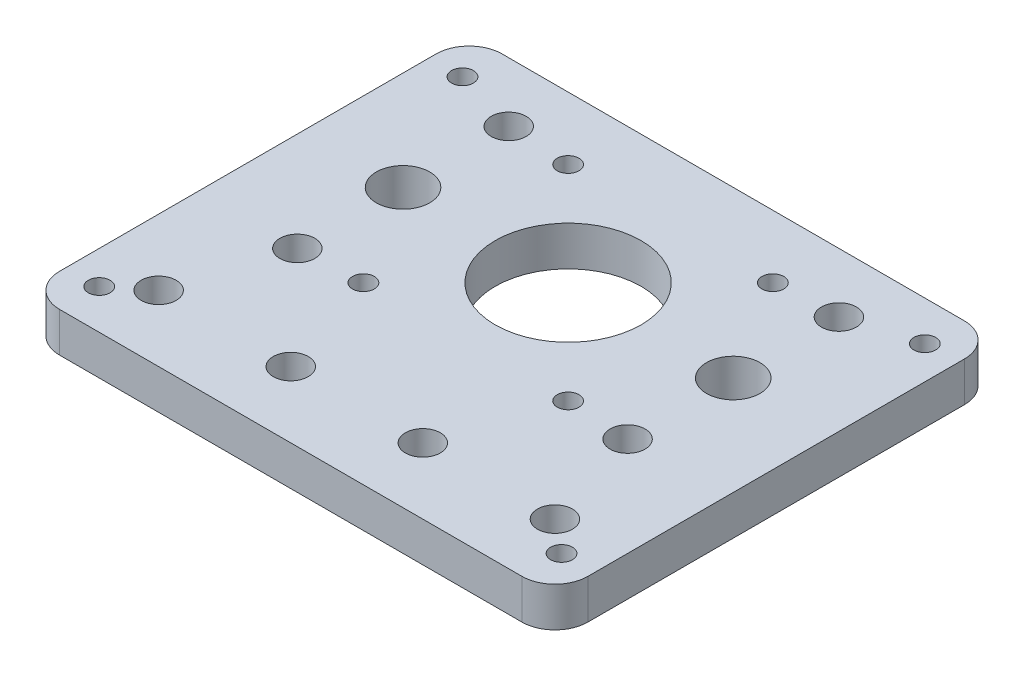
ISO-10303-21;
HEADER;
FILE_DESCRIPTION(('STEP AP214'),'2;1');
FILE_NAME('part.step','',(''),(''),'','','');
FILE_SCHEMA(('AUTOMOTIVE_DESIGN { 1 0 10303 214 1 1 1 1 }'));
ENDSEC;
DATA;
#1=APPLICATION_CONTEXT('core data for automotive mechanical design processes');
#2=APPLICATION_PROTOCOL_DEFINITION('international standard','automotive_design',2000,#1);
#3=PRODUCT_CONTEXT('',#1,'mechanical');
#4=PRODUCT('Part','Part','',(#3));
#5=PRODUCT_RELATED_PRODUCT_CATEGORY('part','',(#4));
#6=PRODUCT_DEFINITION_FORMATION('','',#4);
#7=PRODUCT_DEFINITION_CONTEXT('part definition',#1,'design');
#8=PRODUCT_DEFINITION('design','',#6,#7);
#9=PRODUCT_DEFINITION_SHAPE('','',#8);
#10=(LENGTH_UNIT() NAMED_UNIT(*) SI_UNIT(.MILLI.,.METRE.));
#11=(NAMED_UNIT(*) PLANE_ANGLE_UNIT() SI_UNIT($,.RADIAN.));
#12=(NAMED_UNIT(*) SI_UNIT($,.STERADIAN.) SOLID_ANGLE_UNIT());
#13=UNCERTAINTY_MEASURE_WITH_UNIT(LENGTH_MEASURE(1.E-05),#10,'distance_accuracy_value','');
#14=(GEOMETRIC_REPRESENTATION_CONTEXT(3) GLOBAL_UNCERTAINTY_ASSIGNED_CONTEXT((#13)) GLOBAL_UNIT_ASSIGNED_CONTEXT((#10,
#11,#12)) REPRESENTATION_CONTEXT('',''));
#15=CARTESIAN_POINT('',(0.,0.,0.));
#16=DIRECTION('',(0.,0.,1.));
#17=DIRECTION('',(1.,0.,0.));
#18=AXIS2_PLACEMENT_3D('',#15,#16,#17);
#19=CARTESIAN_POINT('',(-35.,6.,37.));
#20=DIRECTION('',(0.,1.,0.));
#21=DIRECTION('',(0.,0.,1.));
#22=AXIS2_PLACEMENT_3D('',#19,#20,#21);
#23=PLANE('',#22);
#24=CARTESIAN_POINT('',(35.,6.,36.));
#25=DIRECTION('',(0.,1.,0.));
#26=DIRECTION('',(0.,0.,-1.));
#27=AXIS2_PLACEMENT_3D('',#24,#25,#26);
#28=CIRCLE('',#27,1.65);
#29=CARTESIAN_POINT('',(35.,6.,34.35));
#30=VERTEX_POINT('',#29);
#31=EDGE_CURVE('E280',#30,#30,#28,.T.);
#32=ORIENTED_EDGE('',*,*,#31,.F.);
#33=EDGE_LOOP('',(#32));
#34=FACE_BOUND('',#33,.T.);
#35=CARTESIAN_POINT('',(9.99999999999998,6.,32.));
#36=DIRECTION('',(0.,1.,0.));
#37=DIRECTION('',(0.,0.,-1.));
#38=AXIS2_PLACEMENT_3D('',#35,#36,#37);
#39=CIRCLE('',#38,2.65);
#40=CARTESIAN_POINT('',(9.99999999999998,6.,29.35));
#41=VERTEX_POINT('',#40);
#42=EDGE_CURVE('E268',#41,#41,#39,.T.);
#43=ORIENTED_EDGE('',*,*,#42,.F.);
#44=EDGE_LOOP('',(#43));
#45=FACE_BOUND('',#44,.T.);
#46=CARTESIAN_POINT('',(-30.,6.,32.));
#47=DIRECTION('',(0.,1.,0.));
#48=DIRECTION('',(0.,0.,1.));
#49=AXIS2_PLACEMENT_3D('',#46,#47,#48);
#50=CIRCLE('',#49,2.65);
#51=CARTESIAN_POINT('',(-30.,6.,34.65));
#52=VERTEX_POINT('',#51);
#53=EDGE_CURVE('E256',#52,#52,#50,.T.);
#54=ORIENTED_EDGE('',*,*,#53,.F.);
#55=EDGE_LOOP('',(#54));
#56=FACE_BOUND('',#55,.T.);
#57=CARTESIAN_POINT('',(-9.99999999999998,6.,32.));
#58=DIRECTION('',(0.,1.,0.));
#59=DIRECTION('',(0.,0.,1.));
#60=AXIS2_PLACEMENT_3D('',#57,#58,#59);
#61=CIRCLE('',#60,2.65);
#62=CARTESIAN_POINT('',(-9.99999999999998,6.,34.65));
#63=VERTEX_POINT('',#62);
#64=EDGE_CURVE('E244',#63,#63,#61,.T.);
#65=ORIENTED_EDGE('',*,*,#64,.F.);
#66=EDGE_LOOP('',(#65));
#67=FACE_BOUND('',#66,.T.);
#68=CARTESIAN_POINT('',(25.,6.,16.));
#69=DIRECTION('',(0.,1.,0.));
#70=DIRECTION('',(0.,0.,1.));
#71=AXIS2_PLACEMENT_3D('',#68,#69,#70);
#72=CIRCLE('',#71,2.65);
#73=CARTESIAN_POINT('',(25.,6.,18.65));
#74=VERTEX_POINT('',#73);
#75=EDGE_CURVE('E232',#74,#74,#72,.T.);
#76=ORIENTED_EDGE('',*,*,#75,.F.);
#77=EDGE_LOOP('',(#76));
#78=FACE_BOUND('',#77,.T.);
#79=CARTESIAN_POINT('',(-25.,6.,16.));
#80=DIRECTION('',(0.,1.,0.));
#81=DIRECTION('',(0.,0.,-1.));
#82=AXIS2_PLACEMENT_3D('',#79,#80,#81);
#83=CIRCLE('',#82,2.65);
#84=CARTESIAN_POINT('',(-25.,6.,13.35));
#85=VERTEX_POINT('',#84);
#86=EDGE_CURVE('E220',#85,#85,#83,.T.);
#87=ORIENTED_EDGE('',*,*,#86,.F.);
#88=EDGE_LOOP('',(#87));
#89=FACE_BOUND('',#88,.T.);
#90=CARTESIAN_POINT('',(-25.,6.,0.));
#91=DIRECTION('',(0.,1.,0.));
#92=DIRECTION('',(0.,0.,1.));
#93=AXIS2_PLACEMENT_3D('',#90,#91,#92);
#94=CIRCLE('',#93,4.05);
#95=CARTESIAN_POINT('',(-25.,6.,4.05));
#96=VERTEX_POINT('',#95);
#97=EDGE_CURVE('E208',#96,#96,#94,.T.);
#98=ORIENTED_EDGE('',*,*,#97,.F.);
#99=EDGE_LOOP('',(#98));
#100=FACE_BOUND('',#99,.T.);
#101=CARTESIAN_POINT('',(15.5,6.,15.5));
#102=DIRECTION('',(0.,1.,0.));
#103=DIRECTION('',(0.,0.,1.));
#104=AXIS2_PLACEMENT_3D('',#101,#102,#103);
#105=CIRCLE('',#104,1.65);
#106=CARTESIAN_POINT('',(15.5,6.,17.15));
#107=VERTEX_POINT('',#106);
#108=EDGE_CURVE('E196',#107,#107,#105,.T.);
#109=ORIENTED_EDGE('',*,*,#108,.F.);
#110=EDGE_LOOP('',(#109));
#111=FACE_BOUND('',#110,.T.);
#112=CARTESIAN_POINT('',(-15.5,6.,-15.5));
#113=DIRECTION('',(0.,1.,0.));
#114=DIRECTION('',(0.,0.,1.));
#115=AXIS2_PLACEMENT_3D('',#112,#113,#114);
#116=CIRCLE('',#115,1.65);
#117=CARTESIAN_POINT('',(-15.5,6.,-13.85));
#118=VERTEX_POINT('',#117);
#119=EDGE_CURVE('E184',#118,#118,#116,.T.);
#120=ORIENTED_EDGE('',*,*,#119,.F.);
#121=EDGE_LOOP('',(#120));
#122=FACE_BOUND('',#121,.T.);
#123=CARTESIAN_POINT('',(-35.,6.,37.));
#124=DIRECTION('',(0.,1.,0.));
#125=DIRECTION('',(0.,0.,1.));
#126=AXIS2_PLACEMENT_3D('',#123,#124,#125);
#127=CIRCLE('',#126,5.);
#128=CARTESIAN_POINT('',(-40.,6.,37.));
#129=VERTEX_POINT('',#128);
#130=CARTESIAN_POINT('',(-35.,6.,42.));
#131=VERTEX_POINT('',#130);
#132=EDGE_CURVE('E147',#129,#131,#127,.T.);
#133=ORIENTED_EDGE('',*,*,#132,.T.);
#134=DIRECTION('',(1.,0.,0.));
#135=VECTOR('',#134,1.);
#136=CARTESIAN_POINT('',(-35.,6.,42.));
#137=LINE('',#136,#135);
#138=CARTESIAN_POINT('',(35.,6.,42.));
#139=VERTEX_POINT('',#138);
#140=EDGE_CURVE('E95',#131,#139,#137,.T.);
#141=ORIENTED_EDGE('',*,*,#140,.T.);
#142=CARTESIAN_POINT('',(35.,6.,37.));
#143=DIRECTION('',(0.,1.,0.));
#144=DIRECTION('',(0.,0.,1.));
#145=AXIS2_PLACEMENT_3D('',#142,#143,#144);
#146=CIRCLE('',#145,5.);
#147=CARTESIAN_POINT('',(40.,6.,37.));
#148=VERTEX_POINT('',#147);
#149=EDGE_CURVE('E162',#139,#148,#146,.T.);
#150=ORIENTED_EDGE('',*,*,#149,.T.);
#151=DIRECTION('',(0.,0.,-1.));
#152=VECTOR('',#151,1.);
#153=CARTESIAN_POINT('',(40.,6.,-20.));
#154=LINE('',#153,#152);
#155=CARTESIAN_POINT('',(40.,6.,-20.));
#156=VERTEX_POINT('',#155);
#157=EDGE_CURVE('E175',#148,#156,#154,.T.);
#158=ORIENTED_EDGE('',*,*,#157,.T.);
#159=CARTESIAN_POINT('',(35.,6.,-20.));
#160=DIRECTION('',(0.,1.,0.));
#161=DIRECTION('',(0.,0.,1.));
#162=AXIS2_PLACEMENT_3D('',#159,#160,#161);
#163=CIRCLE('',#162,5.);
#164=CARTESIAN_POINT('',(35.,6.,-25.));
#165=VERTEX_POINT('',#164);
#166=EDGE_CURVE('E114',#156,#165,#163,.T.);
#167=ORIENTED_EDGE('',*,*,#166,.T.);
#168=DIRECTION('',(-1.,0.,0.));
#169=VECTOR('',#168,1.);
#170=CARTESIAN_POINT('',(-35.,6.,-25.));
#171=LINE('',#170,#169);
#172=CARTESIAN_POINT('',(-35.,6.,-25.));
#173=VERTEX_POINT('',#172);
#174=EDGE_CURVE('E108',#165,#173,#171,.T.);
#175=ORIENTED_EDGE('',*,*,#174,.T.);
#176=CARTESIAN_POINT('',(-35.,6.,-20.));
#177=DIRECTION('',(0.,1.,0.));
#178=DIRECTION('',(0.,0.,1.));
#179=AXIS2_PLACEMENT_3D('',#176,#177,#178);
#180=CIRCLE('',#179,5.);
#181=CARTESIAN_POINT('',(-40.,6.,-20.));
#182=VERTEX_POINT('',#181);
#183=EDGE_CURVE('E112',#173,#182,#180,.T.);
#184=ORIENTED_EDGE('',*,*,#183,.T.);
#185=DIRECTION('',(0.,0.,1.));
#186=VECTOR('',#185,1.);
#187=CARTESIAN_POINT('',(-40.,6.,-20.));
#188=LINE('',#187,#186);
#189=EDGE_CURVE('E52',#182,#129,#188,.T.);
#190=ORIENTED_EDGE('',*,*,#189,.T.);
#191=EDGE_LOOP('',(#133,#141,#150,#158,#167,#175,#184,#190));
#192=FACE_BOUND('',#191,.T.);
#193=CARTESIAN_POINT('',(0.,6.,0.));
#194=DIRECTION('',(0.,1.,0.));
#195=DIRECTION('',(0.,0.,1.));
#196=AXIS2_PLACEMENT_3D('',#193,#194,#195);
#197=CIRCLE('',#196,11.05);
#198=CARTESIAN_POINT('',(0.,6.,11.05));
#199=VERTEX_POINT('',#198);
#200=EDGE_CURVE('E136',#199,#199,#197,.T.);
#201=ORIENTED_EDGE('',*,*,#200,.F.);
#202=EDGE_LOOP('',(#201));
#203=FACE_BOUND('',#202,.T.);
#204=CARTESIAN_POINT('',(15.5,6.,-15.5));
#205=DIRECTION('',(0.,1.,0.));
#206=DIRECTION('',(0.,0.,1.));
#207=AXIS2_PLACEMENT_3D('',#204,#205,#206);
#208=CIRCLE('',#207,1.65);
#209=CARTESIAN_POINT('',(15.5,6.,-13.85));
#210=VERTEX_POINT('',#209);
#211=EDGE_CURVE('E190',#210,#210,#208,.T.);
#212=ORIENTED_EDGE('',*,*,#211,.F.);
#213=EDGE_LOOP('',(#212));
#214=FACE_BOUND('',#213,.T.);
#215=CARTESIAN_POINT('',(-15.5,6.,15.5));
#216=DIRECTION('',(0.,1.,0.));
#217=DIRECTION('',(0.,0.,1.));
#218=AXIS2_PLACEMENT_3D('',#215,#216,#217);
#219=CIRCLE('',#218,1.65);
#220=CARTESIAN_POINT('',(-15.5,6.,17.15));
#221=VERTEX_POINT('',#220);
#222=EDGE_CURVE('E202',#221,#221,#219,.T.);
#223=ORIENTED_EDGE('',*,*,#222,.F.);
#224=EDGE_LOOP('',(#223));
#225=FACE_BOUND('',#224,.T.);
#226=CARTESIAN_POINT('',(-25.,6.,-16.));
#227=DIRECTION('',(0.,1.,0.));
#228=DIRECTION('',(0.,0.,1.));
#229=AXIS2_PLACEMENT_3D('',#226,#227,#228);
#230=CIRCLE('',#229,2.65);
#231=CARTESIAN_POINT('',(-25.,6.,-13.35));
#232=VERTEX_POINT('',#231);
#233=EDGE_CURVE('E214',#232,#232,#230,.T.);
#234=ORIENTED_EDGE('',*,*,#233,.F.);
#235=EDGE_LOOP('',(#234));
#236=FACE_BOUND('',#235,.T.);
#237=CARTESIAN_POINT('',(25.,6.,0.));
#238=DIRECTION('',(0.,1.,0.));
#239=DIRECTION('',(0.,0.,-1.));
#240=AXIS2_PLACEMENT_3D('',#237,#238,#239);
#241=CIRCLE('',#240,4.05);
#242=CARTESIAN_POINT('',(25.,6.,-4.05));
#243=VERTEX_POINT('',#242);
#244=EDGE_CURVE('E226',#243,#243,#241,.T.);
#245=ORIENTED_EDGE('',*,*,#244,.F.);
#246=EDGE_LOOP('',(#245));
#247=FACE_BOUND('',#246,.T.);
#248=CARTESIAN_POINT('',(25.,6.,-16.));
#249=DIRECTION('',(0.,1.,0.));
#250=DIRECTION('',(0.,0.,-1.));
#251=AXIS2_PLACEMENT_3D('',#248,#249,#250);
#252=CIRCLE('',#251,2.65);
#253=CARTESIAN_POINT('',(25.,6.,-18.65));
#254=VERTEX_POINT('',#253);
#255=EDGE_CURVE('E238',#254,#254,#252,.T.);
#256=ORIENTED_EDGE('',*,*,#255,.F.);
#257=EDGE_LOOP('',(#256));
#258=FACE_BOUND('',#257,.T.);
#259=CARTESIAN_POINT('',(-35.,6.,36.));
#260=DIRECTION('',(0.,1.,0.));
#261=DIRECTION('',(0.,0.,1.));
#262=AXIS2_PLACEMENT_3D('',#259,#260,#261);
#263=CIRCLE('',#262,1.65);
#264=CARTESIAN_POINT('',(-35.,6.,37.65));
#265=VERTEX_POINT('',#264);
#266=EDGE_CURVE('E250',#265,#265,#263,.T.);
#267=ORIENTED_EDGE('',*,*,#266,.F.);
#268=EDGE_LOOP('',(#267));
#269=FACE_BOUND('',#268,.T.);
#270=CARTESIAN_POINT('',(30.,6.,32.));
#271=DIRECTION('',(0.,1.,0.));
#272=DIRECTION('',(0.,0.,-1.));
#273=AXIS2_PLACEMENT_3D('',#270,#271,#272);
#274=CIRCLE('',#273,2.65);
#275=CARTESIAN_POINT('',(30.,6.,29.35));
#276=VERTEX_POINT('',#275);
#277=EDGE_CURVE('E262',#276,#276,#274,.T.);
#278=ORIENTED_EDGE('',*,*,#277,.F.);
#279=EDGE_LOOP('',(#278));
#280=FACE_BOUND('',#279,.T.);
#281=CARTESIAN_POINT('',(-35.,6.,-19.));
#282=DIRECTION('',(0.,1.,0.));
#283=DIRECTION('',(0.,0.,1.));
#284=AXIS2_PLACEMENT_3D('',#281,#282,#283);
#285=CIRCLE('',#284,1.65);
#286=CARTESIAN_POINT('',(-35.,6.,-17.35));
#287=VERTEX_POINT('',#286);
#288=EDGE_CURVE('E274',#287,#287,#285,.T.);
#289=ORIENTED_EDGE('',*,*,#288,.F.);
#290=EDGE_LOOP('',(#289));
#291=FACE_BOUND('',#290,.T.);
#292=CARTESIAN_POINT('',(35.,6.,-19.));
#293=DIRECTION('',(0.,1.,0.));
#294=DIRECTION('',(0.,0.,-1.));
#295=AXIS2_PLACEMENT_3D('',#292,#293,#294);
#296=CIRCLE('',#295,1.65);
#297=CARTESIAN_POINT('',(35.,6.,-20.65));
#298=VERTEX_POINT('',#297);
#299=EDGE_CURVE('E286',#298,#298,#296,.T.);
#300=ORIENTED_EDGE('',*,*,#299,.F.);
#301=EDGE_LOOP('',(#300));
#302=FACE_BOUND('',#301,.T.);
#303=ADVANCED_FACE('F35',(#34,#45,#56,#67,#78,#89,#100,#111,#122,#192,#203,#214,#225,#236,#247,
#258,#269,#280,#291,#302),#23,.T.);
#304=CARTESIAN_POINT('',(-35.,0.,37.));
#305=DIRECTION('',(0.,1.,0.));
#306=DIRECTION('',(0.,0.,1.));
#307=AXIS2_PLACEMENT_3D('',#304,#305,#306);
#308=PLANE('',#307);
#309=CARTESIAN_POINT('',(-35.,0.,37.));
#310=DIRECTION('',(0.,1.,0.));
#311=DIRECTION('',(0.,0.,1.));
#312=AXIS2_PLACEMENT_3D('',#309,#310,#311);
#313=CIRCLE('',#312,5.);
#314=CARTESIAN_POINT('',(-40.,0.,37.));
#315=VERTEX_POINT('',#314);
#316=CARTESIAN_POINT('',(-35.,0.,42.));
#317=VERTEX_POINT('',#316);
#318=EDGE_CURVE('E132',#315,#317,#313,.T.);
#319=ORIENTED_EDGE('',*,*,#318,.F.);
#320=DIRECTION('',(0.,0.,1.));
#321=VECTOR('',#320,1.);
#322=CARTESIAN_POINT('',(-40.,0.,-20.));
#323=LINE('',#322,#321);
#324=CARTESIAN_POINT('',(-40.,0.,-20.));
#325=VERTEX_POINT('',#324);
#326=EDGE_CURVE('E87',#325,#315,#323,.T.);
#327=ORIENTED_EDGE('',*,*,#326,.F.);
#328=CARTESIAN_POINT('',(-35.,0.,-20.));
#329=DIRECTION('',(0.,1.,0.));
#330=DIRECTION('',(0.,0.,1.));
#331=AXIS2_PLACEMENT_3D('',#328,#329,#330);
#332=CIRCLE('',#331,5.);
#333=CARTESIAN_POINT('',(-35.,0.,-25.));
#334=VERTEX_POINT('',#333);
#335=EDGE_CURVE('E81',#334,#325,#332,.T.);
#336=ORIENTED_EDGE('',*,*,#335,.F.);
#337=DIRECTION('',(-1.,0.,0.));
#338=VECTOR('',#337,1.);
#339=CARTESIAN_POINT('',(-35.,0.,-25.));
#340=LINE('',#339,#338);
#341=CARTESIAN_POINT('',(35.,0.,-25.));
#342=VERTEX_POINT('',#341);
#343=EDGE_CURVE('E122',#342,#334,#340,.T.);
#344=ORIENTED_EDGE('',*,*,#343,.F.);
#345=CARTESIAN_POINT('',(35.,0.,-20.));
#346=DIRECTION('',(0.,1.,0.));
#347=DIRECTION('',(0.,0.,1.));
#348=AXIS2_PLACEMENT_3D('',#345,#346,#347);
#349=CIRCLE('',#348,5.);
#350=CARTESIAN_POINT('',(40.,0.,-20.));
#351=VERTEX_POINT('',#350);
#352=EDGE_CURVE('E142',#351,#342,#349,.T.);
#353=ORIENTED_EDGE('',*,*,#352,.F.);
#354=DIRECTION('',(0.,0.,-1.));
#355=VECTOR('',#354,1.);
#356=CARTESIAN_POINT('',(40.,0.,-20.));
#357=LINE('',#356,#355);
#358=CARTESIAN_POINT('',(40.,0.,37.));
#359=VERTEX_POINT('',#358);
#360=EDGE_CURVE('E140',#359,#351,#357,.T.);
#361=ORIENTED_EDGE('',*,*,#360,.F.);
#362=CARTESIAN_POINT('',(35.,0.,37.));
#363=DIRECTION('',(0.,1.,0.));
#364=DIRECTION('',(0.,0.,1.));
#365=AXIS2_PLACEMENT_3D('',#362,#363,#364);
#366=CIRCLE('',#365,5.);
#367=CARTESIAN_POINT('',(35.,0.,42.));
#368=VERTEX_POINT('',#367);
#369=EDGE_CURVE('E138',#368,#359,#366,.T.);
#370=ORIENTED_EDGE('',*,*,#369,.F.);
#371=DIRECTION('',(1.,0.,0.));
#372=VECTOR('',#371,1.);
#373=CARTESIAN_POINT('',(-35.,0.,42.));
#374=LINE('',#373,#372);
#375=EDGE_CURVE('E135',#317,#368,#374,.T.);
#376=ORIENTED_EDGE('',*,*,#375,.F.);
#377=EDGE_LOOP('',(#319,#327,#336,#344,#353,#361,#370,#376));
#378=FACE_BOUND('',#377,.T.);
#379=CARTESIAN_POINT('',(0.,0.,0.));
#380=DIRECTION('',(0.,1.,0.));
#381=DIRECTION('',(0.,0.,1.));
#382=AXIS2_PLACEMENT_3D('',#379,#380,#381);
#383=CIRCLE('',#382,11.05);
#384=CARTESIAN_POINT('',(0.,0.,11.05));
#385=VERTEX_POINT('',#384);
#386=EDGE_CURVE('E181',#385,#385,#383,.T.);
#387=ORIENTED_EDGE('',*,*,#386,.T.);
#388=EDGE_LOOP('',(#387));
#389=FACE_BOUND('',#388,.T.);
#390=CARTESIAN_POINT('',(-15.5,0.,-15.5));
#391=DIRECTION('',(0.,1.,0.));
#392=DIRECTION('',(0.,0.,1.));
#393=AXIS2_PLACEMENT_3D('',#390,#391,#392);
#394=CIRCLE('',#393,1.65);
#395=CARTESIAN_POINT('',(-15.5,0.,-13.85));
#396=VERTEX_POINT('',#395);
#397=EDGE_CURVE('E187',#396,#396,#394,.T.);
#398=ORIENTED_EDGE('',*,*,#397,.T.);
#399=EDGE_LOOP('',(#398));
#400=FACE_BOUND('',#399,.T.);
#401=CARTESIAN_POINT('',(15.5,0.,-15.5));
#402=DIRECTION('',(0.,1.,0.));
#403=DIRECTION('',(0.,0.,1.));
#404=AXIS2_PLACEMENT_3D('',#401,#402,#403);
#405=CIRCLE('',#404,1.65);
#406=CARTESIAN_POINT('',(15.5,0.,-13.85));
#407=VERTEX_POINT('',#406);
#408=EDGE_CURVE('E193',#407,#407,#405,.T.);
#409=ORIENTED_EDGE('',*,*,#408,.T.);
#410=EDGE_LOOP('',(#409));
#411=FACE_BOUND('',#410,.T.);
#412=CARTESIAN_POINT('',(15.5,0.,15.5));
#413=DIRECTION('',(0.,1.,0.));
#414=DIRECTION('',(0.,0.,1.));
#415=AXIS2_PLACEMENT_3D('',#412,#413,#414);
#416=CIRCLE('',#415,1.65);
#417=CARTESIAN_POINT('',(15.5,0.,17.15));
#418=VERTEX_POINT('',#417);
#419=EDGE_CURVE('E199',#418,#418,#416,.T.);
#420=ORIENTED_EDGE('',*,*,#419,.T.);
#421=EDGE_LOOP('',(#420));
#422=FACE_BOUND('',#421,.T.);
#423=CARTESIAN_POINT('',(-15.5,0.,15.5));
#424=DIRECTION('',(0.,1.,0.));
#425=DIRECTION('',(0.,0.,1.));
#426=AXIS2_PLACEMENT_3D('',#423,#424,#425);
#427=CIRCLE('',#426,1.65);
#428=CARTESIAN_POINT('',(-15.5,0.,17.15));
#429=VERTEX_POINT('',#428);
#430=EDGE_CURVE('E205',#429,#429,#427,.T.);
#431=ORIENTED_EDGE('',*,*,#430,.T.);
#432=EDGE_LOOP('',(#431));
#433=FACE_BOUND('',#432,.T.);
#434=CARTESIAN_POINT('',(-25.,0.,0.));
#435=DIRECTION('',(0.,1.,0.));
#436=DIRECTION('',(0.,0.,1.));
#437=AXIS2_PLACEMENT_3D('',#434,#435,#436);
#438=CIRCLE('',#437,4.05);
#439=CARTESIAN_POINT('',(-25.,0.,4.05));
#440=VERTEX_POINT('',#439);
#441=EDGE_CURVE('E211',#440,#440,#438,.T.);
#442=ORIENTED_EDGE('',*,*,#441,.T.);
#443=EDGE_LOOP('',(#442));
#444=FACE_BOUND('',#443,.T.);
#445=CARTESIAN_POINT('',(-25.,0.,-16.));
#446=DIRECTION('',(0.,1.,0.));
#447=DIRECTION('',(0.,0.,1.));
#448=AXIS2_PLACEMENT_3D('',#445,#446,#447);
#449=CIRCLE('',#448,2.65);
#450=CARTESIAN_POINT('',(-25.,0.,-13.35));
#451=VERTEX_POINT('',#450);
#452=EDGE_CURVE('E217',#451,#451,#449,.T.);
#453=ORIENTED_EDGE('',*,*,#452,.T.);
#454=EDGE_LOOP('',(#453));
#455=FACE_BOUND('',#454,.T.);
#456=CARTESIAN_POINT('',(-25.,0.,16.));
#457=DIRECTION('',(0.,1.,0.));
#458=DIRECTION('',(0.,0.,-1.));
#459=AXIS2_PLACEMENT_3D('',#456,#457,#458);
#460=CIRCLE('',#459,2.65);
#461=CARTESIAN_POINT('',(-25.,0.,13.35));
#462=VERTEX_POINT('',#461);
#463=EDGE_CURVE('E223',#462,#462,#460,.T.);
#464=ORIENTED_EDGE('',*,*,#463,.T.);
#465=EDGE_LOOP('',(#464));
#466=FACE_BOUND('',#465,.T.);
#467=CARTESIAN_POINT('',(25.,0.,0.));
#468=DIRECTION('',(0.,1.,0.));
#469=DIRECTION('',(0.,0.,-1.));
#470=AXIS2_PLACEMENT_3D('',#467,#468,#469);
#471=CIRCLE('',#470,4.05);
#472=CARTESIAN_POINT('',(25.,0.,-4.05));
#473=VERTEX_POINT('',#472);
#474=EDGE_CURVE('E229',#473,#473,#471,.T.);
#475=ORIENTED_EDGE('',*,*,#474,.T.);
#476=EDGE_LOOP('',(#475));
#477=FACE_BOUND('',#476,.T.);
#478=CARTESIAN_POINT('',(25.,0.,16.));
#479=DIRECTION('',(0.,1.,0.));
#480=DIRECTION('',(0.,0.,1.));
#481=AXIS2_PLACEMENT_3D('',#478,#479,#480);
#482=CIRCLE('',#481,2.65);
#483=CARTESIAN_POINT('',(25.,0.,18.65));
#484=VERTEX_POINT('',#483);
#485=EDGE_CURVE('E235',#484,#484,#482,.T.);
#486=ORIENTED_EDGE('',*,*,#485,.T.);
#487=EDGE_LOOP('',(#486));
#488=FACE_BOUND('',#487,.T.);
#489=CARTESIAN_POINT('',(25.,0.,-16.));
#490=DIRECTION('',(0.,1.,0.));
#491=DIRECTION('',(0.,0.,-1.));
#492=AXIS2_PLACEMENT_3D('',#489,#490,#491);
#493=CIRCLE('',#492,2.65);
#494=CARTESIAN_POINT('',(25.,0.,-18.65));
#495=VERTEX_POINT('',#494);
#496=EDGE_CURVE('E241',#495,#495,#493,.T.);
#497=ORIENTED_EDGE('',*,*,#496,.T.);
#498=EDGE_LOOP('',(#497));
#499=FACE_BOUND('',#498,.T.);
#500=CARTESIAN_POINT('',(-9.99999999999998,0.,32.));
#501=DIRECTION('',(0.,1.,0.));
#502=DIRECTION('',(0.,0.,1.));
#503=AXIS2_PLACEMENT_3D('',#500,#501,#502);
#504=CIRCLE('',#503,2.65);
#505=CARTESIAN_POINT('',(-9.99999999999998,0.,34.65));
#506=VERTEX_POINT('',#505);
#507=EDGE_CURVE('E247',#506,#506,#504,.T.);
#508=ORIENTED_EDGE('',*,*,#507,.T.);
#509=EDGE_LOOP('',(#508));
#510=FACE_BOUND('',#509,.T.);
#511=CARTESIAN_POINT('',(-35.,0.,36.));
#512=DIRECTION('',(0.,1.,0.));
#513=DIRECTION('',(0.,0.,1.));
#514=AXIS2_PLACEMENT_3D('',#511,#512,#513);
#515=CIRCLE('',#514,1.65);
#516=CARTESIAN_POINT('',(-35.,0.,37.65));
#517=VERTEX_POINT('',#516);
#518=EDGE_CURVE('E253',#517,#517,#515,.T.);
#519=ORIENTED_EDGE('',*,*,#518,.T.);
#520=EDGE_LOOP('',(#519));
#521=FACE_BOUND('',#520,.T.);
#522=CARTESIAN_POINT('',(-30.,0.,32.));
#523=DIRECTION('',(0.,1.,0.));
#524=DIRECTION('',(0.,0.,1.));
#525=AXIS2_PLACEMENT_3D('',#522,#523,#524);
#526=CIRCLE('',#525,2.65);
#527=CARTESIAN_POINT('',(-30.,0.,34.65));
#528=VERTEX_POINT('',#527);
#529=EDGE_CURVE('E259',#528,#528,#526,.T.);
#530=ORIENTED_EDGE('',*,*,#529,.T.);
#531=EDGE_LOOP('',(#530));
#532=FACE_BOUND('',#531,.T.);
#533=CARTESIAN_POINT('',(30.,0.,32.));
#534=DIRECTION('',(0.,1.,0.));
#535=DIRECTION('',(0.,0.,-1.));
#536=AXIS2_PLACEMENT_3D('',#533,#534,#535);
#537=CIRCLE('',#536,2.65);
#538=CARTESIAN_POINT('',(30.,0.,29.35));
#539=VERTEX_POINT('',#538);
#540=EDGE_CURVE('E265',#539,#539,#537,.T.);
#541=ORIENTED_EDGE('',*,*,#540,.T.);
#542=EDGE_LOOP('',(#541));
#543=FACE_BOUND('',#542,.T.);
#544=CARTESIAN_POINT('',(9.99999999999998,0.,32.));
#545=DIRECTION('',(0.,1.,0.));
#546=DIRECTION('',(0.,0.,-1.));
#547=AXIS2_PLACEMENT_3D('',#544,#545,#546);
#548=CIRCLE('',#547,2.65);
#549=CARTESIAN_POINT('',(9.99999999999998,0.,29.35));
#550=VERTEX_POINT('',#549);
#551=EDGE_CURVE('E271',#550,#550,#548,.T.);
#552=ORIENTED_EDGE('',*,*,#551,.T.);
#553=EDGE_LOOP('',(#552));
#554=FACE_BOUND('',#553,.T.);
#555=CARTESIAN_POINT('',(-35.,0.,-19.));
#556=DIRECTION('',(0.,1.,0.));
#557=DIRECTION('',(0.,0.,1.));
#558=AXIS2_PLACEMENT_3D('',#555,#556,#557);
#559=CIRCLE('',#558,1.65);
#560=CARTESIAN_POINT('',(-35.,0.,-17.35));
#561=VERTEX_POINT('',#560);
#562=EDGE_CURVE('E277',#561,#561,#559,.T.);
#563=ORIENTED_EDGE('',*,*,#562,.T.);
#564=EDGE_LOOP('',(#563));
#565=FACE_BOUND('',#564,.T.);
#566=CARTESIAN_POINT('',(35.,0.,36.));
#567=DIRECTION('',(0.,1.,0.));
#568=DIRECTION('',(0.,0.,-1.));
#569=AXIS2_PLACEMENT_3D('',#566,#567,#568);
#570=CIRCLE('',#569,1.65);
#571=CARTESIAN_POINT('',(35.,0.,34.35));
#572=VERTEX_POINT('',#571);
#573=EDGE_CURVE('E283',#572,#572,#570,.T.);
#574=ORIENTED_EDGE('',*,*,#573,.T.);
#575=EDGE_LOOP('',(#574));
#576=FACE_BOUND('',#575,.T.);
#577=CARTESIAN_POINT('',(35.,0.,-19.));
#578=DIRECTION('',(0.,1.,0.));
#579=DIRECTION('',(0.,0.,-1.));
#580=AXIS2_PLACEMENT_3D('',#577,#578,#579);
#581=CIRCLE('',#580,1.65);
#582=CARTESIAN_POINT('',(35.,0.,-20.65));
#583=VERTEX_POINT('',#582);
#584=EDGE_CURVE('E289',#583,#583,#581,.T.);
#585=ORIENTED_EDGE('',*,*,#584,.T.);
#586=EDGE_LOOP('',(#585));
#587=FACE_BOUND('',#586,.T.);
#588=ADVANCED_FACE('F166',(#378,#389,#400,#411,#422,#433,#444,#455,#466,#477,#488,#499,#510,
#521,#532,#543,#554,#565,#576,#587),#308,.F.);
#589=CARTESIAN_POINT('',(-35.,6.,37.));
#590=DIRECTION('',(0.,-1.,0.));
#591=DIRECTION('',(0.,0.,-1.));
#592=AXIS2_PLACEMENT_3D('',#589,#590,#591);
#593=CYLINDRICAL_SURFACE('',#592,5.);
#594=ORIENTED_EDGE('',*,*,#318,.T.);
#595=DIRECTION('',(0.,-1.,0.));
#596=VECTOR('',#595,1.);
#597=CARTESIAN_POINT('',(-35.,6.,42.));
#598=LINE('',#597,#596);
#599=EDGE_CURVE('E11',#131,#317,#598,.T.);
#600=ORIENTED_EDGE('',*,*,#599,.F.);
#601=ORIENTED_EDGE('',*,*,#132,.F.);
#602=DIRECTION('',(0.,-1.,0.));
#603=VECTOR('',#602,1.);
#604=CARTESIAN_POINT('',(-40.,6.,37.));
#605=LINE('',#604,#603);
#606=EDGE_CURVE('E128',#129,#315,#605,.T.);
#607=ORIENTED_EDGE('',*,*,#606,.T.);
#608=EDGE_LOOP('',(#594,#600,#601,#607));
#609=FACE_BOUND('',#608,.T.);
#610=ADVANCED_FACE('F37',(#609),#593,.T.);
#611=CARTESIAN_POINT('',(-35.,6.,42.));
#612=DIRECTION('',(0.,0.,-1.));
#613=DIRECTION('',(-1.,0.,0.));
#614=AXIS2_PLACEMENT_3D('',#611,#612,#613);
#615=PLANE('',#614);
#616=ORIENTED_EDGE('',*,*,#375,.T.);
#617=DIRECTION('',(0.,-1.,0.));
#618=VECTOR('',#617,1.);
#619=CARTESIAN_POINT('',(35.,6.,42.));
#620=LINE('',#619,#618);
#621=EDGE_CURVE('E44',#139,#368,#620,.T.);
#622=ORIENTED_EDGE('',*,*,#621,.F.);
#623=ORIENTED_EDGE('',*,*,#140,.F.);
#624=ORIENTED_EDGE('',*,*,#599,.T.);
#625=EDGE_LOOP('',(#616,#622,#623,#624));
#626=FACE_BOUND('',#625,.T.);
#627=ADVANCED_FACE('F323',(#626),#615,.F.);
#628=CARTESIAN_POINT('',(35.,6.,37.));
#629=DIRECTION('',(0.,-1.,0.));
#630=DIRECTION('',(0.,0.,-1.));
#631=AXIS2_PLACEMENT_3D('',#628,#629,#630);
#632=CYLINDRICAL_SURFACE('',#631,5.);
#633=ORIENTED_EDGE('',*,*,#369,.T.);
#634=DIRECTION('',(0.,-1.,0.));
#635=VECTOR('',#634,1.);
#636=CARTESIAN_POINT('',(40.,6.,37.));
#637=LINE('',#636,#635);
#638=EDGE_CURVE('E154',#148,#359,#637,.T.);
#639=ORIENTED_EDGE('',*,*,#638,.F.);
#640=ORIENTED_EDGE('',*,*,#149,.F.);
#641=ORIENTED_EDGE('',*,*,#621,.T.);
#642=EDGE_LOOP('',(#633,#639,#640,#641));
#643=FACE_BOUND('',#642,.T.);
#644=ADVANCED_FACE('F160',(#643),#632,.T.);
#645=CARTESIAN_POINT('',(40.,6.,-20.));
#646=DIRECTION('',(-1.,0.,0.));
#647=DIRECTION('',(0.,0.,1.));
#648=AXIS2_PLACEMENT_3D('',#645,#646,#647);
#649=PLANE('',#648);
#650=ORIENTED_EDGE('',*,*,#360,.T.);
#651=DIRECTION('',(0.,-1.,0.));
#652=VECTOR('',#651,1.);
#653=CARTESIAN_POINT('',(40.,6.,-20.));
#654=LINE('',#653,#652);
#655=EDGE_CURVE('E151',#156,#351,#654,.T.);
#656=ORIENTED_EDGE('',*,*,#655,.F.);
#657=ORIENTED_EDGE('',*,*,#157,.F.);
#658=ORIENTED_EDGE('',*,*,#638,.T.);
#659=EDGE_LOOP('',(#650,#656,#657,#658));
#660=FACE_BOUND('',#659,.T.);
#661=ADVANCED_FACE('F171',(#660),#649,.F.);
#662=CARTESIAN_POINT('',(35.,6.,-20.));
#663=DIRECTION('',(0.,-1.,0.));
#664=DIRECTION('',(0.,0.,-1.));
#665=AXIS2_PLACEMENT_3D('',#662,#663,#664);
#666=CYLINDRICAL_SURFACE('',#665,5.);
#667=ORIENTED_EDGE('',*,*,#352,.T.);
#668=DIRECTION('',(0.,-1.,0.));
#669=VECTOR('',#668,1.);
#670=CARTESIAN_POINT('',(35.,6.,-25.));
#671=LINE('',#670,#669);
#672=EDGE_CURVE('E123',#165,#342,#671,.T.);
#673=ORIENTED_EDGE('',*,*,#672,.F.);
#674=ORIENTED_EDGE('',*,*,#166,.F.);
#675=ORIENTED_EDGE('',*,*,#655,.T.);
#676=EDGE_LOOP('',(#667,#673,#674,#675));
#677=FACE_BOUND('',#676,.T.);
#678=ADVANCED_FACE('F174',(#677),#666,.T.);
#679=CARTESIAN_POINT('',(-35.,6.,-25.));
#680=DIRECTION('',(0.,0.,1.));
#681=DIRECTION('',(1.,0.,0.));
#682=AXIS2_PLACEMENT_3D('',#679,#680,#681);
#683=PLANE('',#682);
#684=ORIENTED_EDGE('',*,*,#343,.T.);
#685=DIRECTION('',(0.,-1.,0.));
#686=VECTOR('',#685,1.);
#687=CARTESIAN_POINT('',(-35.,6.,-25.));
#688=LINE('',#687,#686);
#689=EDGE_CURVE('E119',#173,#334,#688,.T.);
#690=ORIENTED_EDGE('',*,*,#689,.F.);
#691=ORIENTED_EDGE('',*,*,#174,.F.);
#692=ORIENTED_EDGE('',*,*,#672,.T.);
#693=EDGE_LOOP('',(#684,#690,#691,#692));
#694=FACE_BOUND('',#693,.T.);
#695=ADVANCED_FACE('F120',(#694),#683,.F.);
#696=CARTESIAN_POINT('',(-35.,6.,-20.));
#697=DIRECTION('',(0.,-1.,0.));
#698=DIRECTION('',(0.,0.,-1.));
#699=AXIS2_PLACEMENT_3D('',#696,#697,#698);
#700=CYLINDRICAL_SURFACE('',#699,5.);
#701=ORIENTED_EDGE('',*,*,#335,.T.);
#702=DIRECTION('',(0.,-1.,0.));
#703=VECTOR('',#702,1.);
#704=CARTESIAN_POINT('',(-40.,6.,-20.));
#705=LINE('',#704,#703);
#706=EDGE_CURVE('E124',#182,#325,#705,.T.);
#707=ORIENTED_EDGE('',*,*,#706,.F.);
#708=ORIENTED_EDGE('',*,*,#183,.F.);
#709=ORIENTED_EDGE('',*,*,#689,.T.);
#710=EDGE_LOOP('',(#701,#707,#708,#709));
#711=FACE_BOUND('',#710,.T.);
#712=ADVANCED_FACE('F126',(#711),#700,.T.);
#713=CARTESIAN_POINT('',(-40.,6.,-20.));
#714=DIRECTION('',(1.,0.,0.));
#715=DIRECTION('',(0.,0.,-1.));
#716=AXIS2_PLACEMENT_3D('',#713,#714,#715);
#717=PLANE('',#716);
#718=ORIENTED_EDGE('',*,*,#326,.T.);
#719=ORIENTED_EDGE('',*,*,#606,.F.);
#720=ORIENTED_EDGE('',*,*,#189,.F.);
#721=ORIENTED_EDGE('',*,*,#706,.T.);
#722=EDGE_LOOP('',(#718,#719,#720,#721));
#723=FACE_BOUND('',#722,.T.);
#724=ADVANCED_FACE('F311',(#723),#717,.F.);
#725=CARTESIAN_POINT('',(0.,6.,0.));
#726=DIRECTION('',(0.,-1.,0.));
#727=DIRECTION('',(0.,0.,-1.));
#728=AXIS2_PLACEMENT_3D('',#725,#726,#727);
#729=CYLINDRICAL_SURFACE('',#728,11.05);
#730=ORIENTED_EDGE('',*,*,#200,.T.);
#731=EDGE_LOOP('',(#730));
#732=FACE_BOUND('',#731,.T.);
#733=ORIENTED_EDGE('',*,*,#386,.F.);
#734=EDGE_LOOP('',(#733));
#735=FACE_BOUND('',#734,.T.);
#736=ADVANCED_FACE('F308',(#732,#735),#729,.F.);
#737=CARTESIAN_POINT('',(-15.5,6.,-15.5));
#738=DIRECTION('',(0.,-1.,0.));
#739=DIRECTION('',(0.,0.,-1.));
#740=AXIS2_PLACEMENT_3D('',#737,#738,#739);
#741=CYLINDRICAL_SURFACE('',#740,1.65);
#742=ORIENTED_EDGE('',*,*,#119,.T.);
#743=EDGE_LOOP('',(#742));
#744=FACE_BOUND('',#743,.T.);
#745=ORIENTED_EDGE('',*,*,#397,.F.);
#746=EDGE_LOOP('',(#745));
#747=FACE_BOUND('',#746,.T.);
#748=ADVANCED_FACE('F387',(#744,#747),#741,.F.);
#749=CARTESIAN_POINT('',(15.5,6.,-15.5));
#750=DIRECTION('',(0.,-1.,0.));
#751=DIRECTION('',(0.,0.,-1.));
#752=AXIS2_PLACEMENT_3D('',#749,#750,#751);
#753=CYLINDRICAL_SURFACE('',#752,1.65);
#754=ORIENTED_EDGE('',*,*,#211,.T.);
#755=EDGE_LOOP('',(#754));
#756=FACE_BOUND('',#755,.T.);
#757=ORIENTED_EDGE('',*,*,#408,.F.);
#758=EDGE_LOOP('',(#757));
#759=FACE_BOUND('',#758,.T.);
#760=ADVANCED_FACE('F395',(#756,#759),#753,.F.);
#761=CARTESIAN_POINT('',(15.5,6.,15.5));
#762=DIRECTION('',(0.,-1.,0.));
#763=DIRECTION('',(0.,0.,-1.));
#764=AXIS2_PLACEMENT_3D('',#761,#762,#763);
#765=CYLINDRICAL_SURFACE('',#764,1.65);
#766=ORIENTED_EDGE('',*,*,#108,.T.);
#767=EDGE_LOOP('',(#766));
#768=FACE_BOUND('',#767,.T.);
#769=ORIENTED_EDGE('',*,*,#419,.F.);
#770=EDGE_LOOP('',(#769));
#771=FACE_BOUND('',#770,.T.);
#772=ADVANCED_FACE('F403',(#768,#771),#765,.F.);
#773=CARTESIAN_POINT('',(-15.5,6.,15.5));
#774=DIRECTION('',(0.,-1.,0.));
#775=DIRECTION('',(0.,0.,-1.));
#776=AXIS2_PLACEMENT_3D('',#773,#774,#775);
#777=CYLINDRICAL_SURFACE('',#776,1.65);
#778=ORIENTED_EDGE('',*,*,#222,.T.);
#779=EDGE_LOOP('',(#778));
#780=FACE_BOUND('',#779,.T.);
#781=ORIENTED_EDGE('',*,*,#430,.F.);
#782=EDGE_LOOP('',(#781));
#783=FACE_BOUND('',#782,.T.);
#784=ADVANCED_FACE('F412',(#780,#783),#777,.F.);
#785=CARTESIAN_POINT('',(-25.,6.,0.));
#786=DIRECTION('',(0.,-1.,0.));
#787=DIRECTION('',(0.,0.,-1.));
#788=AXIS2_PLACEMENT_3D('',#785,#786,#787);
#789=CYLINDRICAL_SURFACE('',#788,4.05);
#790=ORIENTED_EDGE('',*,*,#97,.T.);
#791=EDGE_LOOP('',(#790));
#792=FACE_BOUND('',#791,.T.);
#793=ORIENTED_EDGE('',*,*,#441,.F.);
#794=EDGE_LOOP('',(#793));
#795=FACE_BOUND('',#794,.T.);
#796=ADVANCED_FACE('F421',(#792,#795),#789,.F.);
#797=CARTESIAN_POINT('',(-25.,6.,-16.));
#798=DIRECTION('',(0.,-1.,0.));
#799=DIRECTION('',(0.,0.,-1.));
#800=AXIS2_PLACEMENT_3D('',#797,#798,#799);
#801=CYLINDRICAL_SURFACE('',#800,2.65);
#802=ORIENTED_EDGE('',*,*,#233,.T.);
#803=EDGE_LOOP('',(#802));
#804=FACE_BOUND('',#803,.T.);
#805=ORIENTED_EDGE('',*,*,#452,.F.);
#806=EDGE_LOOP('',(#805));
#807=FACE_BOUND('',#806,.T.);
#808=ADVANCED_FACE('F430',(#804,#807),#801,.F.);
#809=CARTESIAN_POINT('',(-25.,6.,16.));
#810=DIRECTION('',(0.,-1.,0.));
#811=DIRECTION('',(0.,0.,-1.));
#812=AXIS2_PLACEMENT_3D('',#809,#810,#811);
#813=CYLINDRICAL_SURFACE('',#812,2.65);
#814=ORIENTED_EDGE('',*,*,#86,.T.);
#815=EDGE_LOOP('',(#814));
#816=FACE_BOUND('',#815,.T.);
#817=ORIENTED_EDGE('',*,*,#463,.F.);
#818=EDGE_LOOP('',(#817));
#819=FACE_BOUND('',#818,.T.);
#820=ADVANCED_FACE('F439',(#816,#819),#813,.F.);
#821=CARTESIAN_POINT('',(25.,6.,0.));
#822=DIRECTION('',(0.,-1.,0.));
#823=DIRECTION('',(0.,0.,-1.));
#824=AXIS2_PLACEMENT_3D('',#821,#822,#823);
#825=CYLINDRICAL_SURFACE('',#824,4.05);
#826=ORIENTED_EDGE('',*,*,#244,.T.);
#827=EDGE_LOOP('',(#826));
#828=FACE_BOUND('',#827,.T.);
#829=ORIENTED_EDGE('',*,*,#474,.F.);
#830=EDGE_LOOP('',(#829));
#831=FACE_BOUND('',#830,.T.);
#832=ADVANCED_FACE('F448',(#828,#831),#825,.F.);
#833=CARTESIAN_POINT('',(25.,6.,16.));
#834=DIRECTION('',(0.,-1.,0.));
#835=DIRECTION('',(0.,0.,-1.));
#836=AXIS2_PLACEMENT_3D('',#833,#834,#835);
#837=CYLINDRICAL_SURFACE('',#836,2.65);
#838=ORIENTED_EDGE('',*,*,#75,.T.);
#839=EDGE_LOOP('',(#838));
#840=FACE_BOUND('',#839,.T.);
#841=ORIENTED_EDGE('',*,*,#485,.F.);
#842=EDGE_LOOP('',(#841));
#843=FACE_BOUND('',#842,.T.);
#844=ADVANCED_FACE('F457',(#840,#843),#837,.F.);
#845=CARTESIAN_POINT('',(25.,6.,-16.));
#846=DIRECTION('',(0.,-1.,0.));
#847=DIRECTION('',(0.,0.,-1.));
#848=AXIS2_PLACEMENT_3D('',#845,#846,#847);
#849=CYLINDRICAL_SURFACE('',#848,2.65);
#850=ORIENTED_EDGE('',*,*,#255,.T.);
#851=EDGE_LOOP('',(#850));
#852=FACE_BOUND('',#851,.T.);
#853=ORIENTED_EDGE('',*,*,#496,.F.);
#854=EDGE_LOOP('',(#853));
#855=FACE_BOUND('',#854,.T.);
#856=ADVANCED_FACE('F466',(#852,#855),#849,.F.);
#857=CARTESIAN_POINT('',(-9.99999999999998,6.,32.));
#858=DIRECTION('',(0.,-1.,0.));
#859=DIRECTION('',(0.,0.,-1.));
#860=AXIS2_PLACEMENT_3D('',#857,#858,#859);
#861=CYLINDRICAL_SURFACE('',#860,2.65);
#862=ORIENTED_EDGE('',*,*,#64,.T.);
#863=EDGE_LOOP('',(#862));
#864=FACE_BOUND('',#863,.T.);
#865=ORIENTED_EDGE('',*,*,#507,.F.);
#866=EDGE_LOOP('',(#865));
#867=FACE_BOUND('',#866,.T.);
#868=ADVANCED_FACE('F475',(#864,#867),#861,.F.);
#869=CARTESIAN_POINT('',(-35.,6.,36.));
#870=DIRECTION('',(0.,-1.,0.));
#871=DIRECTION('',(0.,0.,-1.));
#872=AXIS2_PLACEMENT_3D('',#869,#870,#871);
#873=CYLINDRICAL_SURFACE('',#872,1.65);
#874=ORIENTED_EDGE('',*,*,#266,.T.);
#875=EDGE_LOOP('',(#874));
#876=FACE_BOUND('',#875,.T.);
#877=ORIENTED_EDGE('',*,*,#518,.F.);
#878=EDGE_LOOP('',(#877));
#879=FACE_BOUND('',#878,.T.);
#880=ADVANCED_FACE('F484',(#876,#879),#873,.F.);
#881=CARTESIAN_POINT('',(-30.,6.,32.));
#882=DIRECTION('',(0.,-1.,0.));
#883=DIRECTION('',(0.,0.,-1.));
#884=AXIS2_PLACEMENT_3D('',#881,#882,#883);
#885=CYLINDRICAL_SURFACE('',#884,2.65);
#886=ORIENTED_EDGE('',*,*,#53,.T.);
#887=EDGE_LOOP('',(#886));
#888=FACE_BOUND('',#887,.T.);
#889=ORIENTED_EDGE('',*,*,#529,.F.);
#890=EDGE_LOOP('',(#889));
#891=FACE_BOUND('',#890,.T.);
#892=ADVANCED_FACE('F493',(#888,#891),#885,.F.);
#893=CARTESIAN_POINT('',(30.,6.,32.));
#894=DIRECTION('',(0.,-1.,0.));
#895=DIRECTION('',(0.,0.,-1.));
#896=AXIS2_PLACEMENT_3D('',#893,#894,#895);
#897=CYLINDRICAL_SURFACE('',#896,2.65);
#898=ORIENTED_EDGE('',*,*,#277,.T.);
#899=EDGE_LOOP('',(#898));
#900=FACE_BOUND('',#899,.T.);
#901=ORIENTED_EDGE('',*,*,#540,.F.);
#902=EDGE_LOOP('',(#901));
#903=FACE_BOUND('',#902,.T.);
#904=ADVANCED_FACE('F502',(#900,#903),#897,.F.);
#905=CARTESIAN_POINT('',(9.99999999999998,6.,32.));
#906=DIRECTION('',(0.,-1.,0.));
#907=DIRECTION('',(0.,0.,-1.));
#908=AXIS2_PLACEMENT_3D('',#905,#906,#907);
#909=CYLINDRICAL_SURFACE('',#908,2.65);
#910=ORIENTED_EDGE('',*,*,#42,.T.);
#911=EDGE_LOOP('',(#910));
#912=FACE_BOUND('',#911,.T.);
#913=ORIENTED_EDGE('',*,*,#551,.F.);
#914=EDGE_LOOP('',(#913));
#915=FACE_BOUND('',#914,.T.);
#916=ADVANCED_FACE('F511',(#912,#915),#909,.F.);
#917=CARTESIAN_POINT('',(-35.,6.,-19.));
#918=DIRECTION('',(0.,-1.,0.));
#919=DIRECTION('',(0.,0.,-1.));
#920=AXIS2_PLACEMENT_3D('',#917,#918,#919);
#921=CYLINDRICAL_SURFACE('',#920,1.65);
#922=ORIENTED_EDGE('',*,*,#288,.T.);
#923=EDGE_LOOP('',(#922));
#924=FACE_BOUND('',#923,.T.);
#925=ORIENTED_EDGE('',*,*,#562,.F.);
#926=EDGE_LOOP('',(#925));
#927=FACE_BOUND('',#926,.T.);
#928=ADVANCED_FACE('F520',(#924,#927),#921,.F.);
#929=CARTESIAN_POINT('',(35.,6.,36.));
#930=DIRECTION('',(0.,-1.,0.));
#931=DIRECTION('',(0.,0.,-1.));
#932=AXIS2_PLACEMENT_3D('',#929,#930,#931);
#933=CYLINDRICAL_SURFACE('',#932,1.65);
#934=ORIENTED_EDGE('',*,*,#31,.T.);
#935=EDGE_LOOP('',(#934));
#936=FACE_BOUND('',#935,.T.);
#937=ORIENTED_EDGE('',*,*,#573,.F.);
#938=EDGE_LOOP('',(#937));
#939=FACE_BOUND('',#938,.T.);
#940=ADVANCED_FACE('F529',(#936,#939),#933,.F.);
#941=CARTESIAN_POINT('',(35.,6.,-19.));
#942=DIRECTION('',(0.,-1.,0.));
#943=DIRECTION('',(0.,0.,-1.));
#944=AXIS2_PLACEMENT_3D('',#941,#942,#943);
#945=CYLINDRICAL_SURFACE('',#944,1.65);
#946=ORIENTED_EDGE('',*,*,#299,.T.);
#947=EDGE_LOOP('',(#946));
#948=FACE_BOUND('',#947,.T.);
#949=ORIENTED_EDGE('',*,*,#584,.F.);
#950=EDGE_LOOP('',(#949));
#951=FACE_BOUND('',#950,.T.);
#952=ADVANCED_FACE('F295',(#948,#951),#945,.F.);
#953=CLOSED_SHELL('',(#303,#588,#610,#627,#644,#661,#678,#695,#712,#724,#736,#748,#760,#772,
#784,#796,#808,#820,#832,#844,#856,#868,#880,#892,#904,#916,#928,#940,#952));
#954=MANIFOLD_SOLID_BREP('B2',#953);
#955=ADVANCED_BREP_SHAPE_REPRESENTATION('',(#18,#954),#14);
#956=SHAPE_DEFINITION_REPRESENTATION(#9,#955);
ENDSEC;
END-ISO-10303-21;
